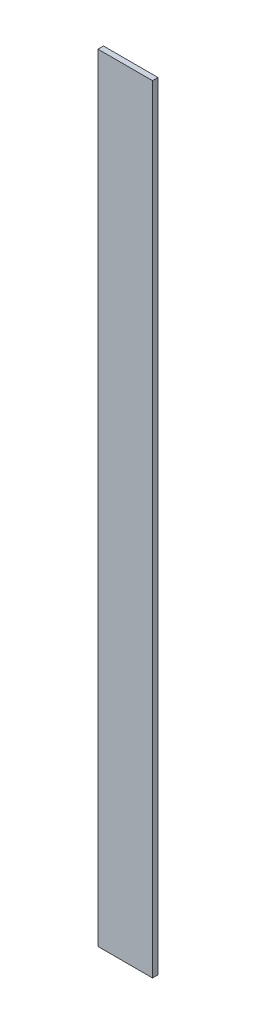
ISO-10303-21;
HEADER;
FILE_DESCRIPTION(('STEP AP214'),'2;1');
FILE_NAME('part.step','',(''),(''),'','','');
FILE_SCHEMA(('AUTOMOTIVE_DESIGN { 1 0 10303 214 1 1 1 1 }'));
ENDSEC;
DATA;
#1=APPLICATION_CONTEXT('core data for automotive mechanical design processes');
#2=APPLICATION_PROTOCOL_DEFINITION('international standard','automotive_design',2000,#1);
#3=PRODUCT_CONTEXT('',#1,'mechanical');
#4=PRODUCT('Part','Part','',(#3));
#5=PRODUCT_RELATED_PRODUCT_CATEGORY('part','',(#4));
#6=PRODUCT_DEFINITION_FORMATION('','',#4);
#7=PRODUCT_DEFINITION_CONTEXT('part definition',#1,'design');
#8=PRODUCT_DEFINITION('design','',#6,#7);
#9=PRODUCT_DEFINITION_SHAPE('','',#8);
#10=(LENGTH_UNIT() NAMED_UNIT(*) SI_UNIT(.MILLI.,.METRE.));
#11=(NAMED_UNIT(*) PLANE_ANGLE_UNIT() SI_UNIT($,.RADIAN.));
#12=(NAMED_UNIT(*) SI_UNIT($,.STERADIAN.) SOLID_ANGLE_UNIT());
#13=UNCERTAINTY_MEASURE_WITH_UNIT(LENGTH_MEASURE(1.E-05),#10,'distance_accuracy_value','');
#14=(GEOMETRIC_REPRESENTATION_CONTEXT(3) GLOBAL_UNCERTAINTY_ASSIGNED_CONTEXT((#13)) GLOBAL_UNIT_ASSIGNED_CONTEXT((#10,
#11,#12)) REPRESENTATION_CONTEXT('',''));
#15=CARTESIAN_POINT('',(0.,0.,0.));
#16=DIRECTION('',(0.,0.,1.));
#17=DIRECTION('',(1.,0.,0.));
#18=AXIS2_PLACEMENT_3D('',#15,#16,#17);
#19=CARTESIAN_POINT('',(0.,0.,3.175));
#20=DIRECTION('',(1.,0.,0.));
#21=DIRECTION('',(0.,0.,-1.));
#22=AXIS2_PLACEMENT_3D('',#19,#20,#21);
#23=PLANE('',#22);
#24=DIRECTION('',(0.,-1.,0.));
#25=VECTOR('',#24,1.);
#26=CARTESIAN_POINT('',(0.,0.,0.));
#27=LINE('',#26,#25);
#28=CARTESIAN_POINT('',(0.,450.,0.));
#29=VERTEX_POINT('',#28);
#30=CARTESIAN_POINT('',(0.,0.,0.));
#31=VERTEX_POINT('',#30);
#32=EDGE_CURVE('E111',#29,#31,#27,.T.);
#33=ORIENTED_EDGE('',*,*,#32,.T.);
#34=DIRECTION('',(0.,0.,-1.));
#35=VECTOR('',#34,1.);
#36=CARTESIAN_POINT('',(0.,0.,3.175));
#37=LINE('',#36,#35);
#38=CARTESIAN_POINT('',(0.,0.,3.175));
#39=VERTEX_POINT('',#38);
#40=EDGE_CURVE('E11',#39,#31,#37,.T.);
#41=ORIENTED_EDGE('',*,*,#40,.F.);
#42=DIRECTION('',(0.,-1.,0.));
#43=VECTOR('',#42,1.);
#44=CARTESIAN_POINT('',(0.,0.,3.175));
#45=LINE('',#44,#43);
#46=CARTESIAN_POINT('',(0.,450.,3.175));
#47=VERTEX_POINT('',#46);
#48=EDGE_CURVE('E95',#47,#39,#45,.T.);
#49=ORIENTED_EDGE('',*,*,#48,.F.);
#50=DIRECTION('',(0.,0.,-1.));
#51=VECTOR('',#50,1.);
#52=CARTESIAN_POINT('',(0.,450.,3.175));
#53=LINE('',#52,#51);
#54=EDGE_CURVE('E107',#47,#29,#53,.T.);
#55=ORIENTED_EDGE('',*,*,#54,.T.);
#56=EDGE_LOOP('',(#33,#41,#49,#55));
#57=FACE_BOUND('',#56,.T.);
#58=ADVANCED_FACE('F43',(#57),#23,.F.);
#59=CARTESIAN_POINT('',(0.,0.,3.175));
#60=DIRECTION('',(0.,1.,0.));
#61=DIRECTION('',(0.,0.,1.));
#62=AXIS2_PLACEMENT_3D('',#59,#60,#61);
#63=PLANE('',#62);
#64=DIRECTION('',(1.,0.,0.));
#65=VECTOR('',#64,1.);
#66=CARTESIAN_POINT('',(0.,0.,0.));
#67=LINE('',#66,#65);
#68=CARTESIAN_POINT('',(31.575,0.,0.));
#69=VERTEX_POINT('',#68);
#70=EDGE_CURVE('E100',#31,#69,#67,.T.);
#71=ORIENTED_EDGE('',*,*,#70,.T.);
#72=DIRECTION('',(0.,0.,-1.));
#73=VECTOR('',#72,1.);
#74=CARTESIAN_POINT('',(31.575,0.,3.175));
#75=LINE('',#74,#73);
#76=CARTESIAN_POINT('',(31.575,0.,3.175));
#77=VERTEX_POINT('',#76);
#78=EDGE_CURVE('E52',#77,#69,#75,.T.);
#79=ORIENTED_EDGE('',*,*,#78,.F.);
#80=DIRECTION('',(1.,0.,0.));
#81=VECTOR('',#80,1.);
#82=CARTESIAN_POINT('',(0.,0.,3.175));
#83=LINE('',#82,#81);
#84=EDGE_CURVE('E90',#39,#77,#83,.T.);
#85=ORIENTED_EDGE('',*,*,#84,.F.);
#86=ORIENTED_EDGE('',*,*,#40,.T.);
#87=EDGE_LOOP('',(#71,#79,#85,#86));
#88=FACE_BOUND('',#87,.T.);
#89=ADVANCED_FACE('F99',(#88),#63,.F.);
#90=CARTESIAN_POINT('',(31.575,0.,3.175));
#91=DIRECTION('',(-1.,0.,0.));
#92=DIRECTION('',(0.,0.,1.));
#93=AXIS2_PLACEMENT_3D('',#90,#91,#92);
#94=PLANE('',#93);
#95=DIRECTION('',(0.,1.,0.));
#96=VECTOR('',#95,1.);
#97=CARTESIAN_POINT('',(31.575,0.,0.));
#98=LINE('',#97,#96);
#99=CARTESIAN_POINT('',(31.575,450.,0.));
#100=VERTEX_POINT('',#99);
#101=EDGE_CURVE('E77',#69,#100,#98,.T.);
#102=ORIENTED_EDGE('',*,*,#101,.T.);
#103=DIRECTION('',(0.,0.,-1.));
#104=VECTOR('',#103,1.);
#105=CARTESIAN_POINT('',(31.575,450.,3.175));
#106=LINE('',#105,#104);
#107=CARTESIAN_POINT('',(31.575,450.,3.175));
#108=VERTEX_POINT('',#107);
#109=EDGE_CURVE('E102',#108,#100,#106,.T.);
#110=ORIENTED_EDGE('',*,*,#109,.F.);
#111=DIRECTION('',(0.,1.,0.));
#112=VECTOR('',#111,1.);
#113=CARTESIAN_POINT('',(31.575,0.,3.175));
#114=LINE('',#113,#112);
#115=EDGE_CURVE('E93',#77,#108,#114,.T.);
#116=ORIENTED_EDGE('',*,*,#115,.F.);
#117=ORIENTED_EDGE('',*,*,#78,.T.);
#118=EDGE_LOOP('',(#102,#110,#116,#117));
#119=FACE_BOUND('',#118,.T.);
#120=ADVANCED_FACE('F103',(#119),#94,.F.);
#121=CARTESIAN_POINT('',(0.,450.,3.175));
#122=DIRECTION('',(0.,-1.,0.));
#123=DIRECTION('',(0.,0.,-1.));
#124=AXIS2_PLACEMENT_3D('',#121,#122,#123);
#125=PLANE('',#124);
#126=DIRECTION('',(-1.,0.,0.));
#127=VECTOR('',#126,1.);
#128=CARTESIAN_POINT('',(0.,450.,0.));
#129=LINE('',#128,#127);
#130=EDGE_CURVE('E83',#100,#29,#129,.T.);
#131=ORIENTED_EDGE('',*,*,#130,.T.);
#132=ORIENTED_EDGE('',*,*,#54,.F.);
#133=DIRECTION('',(-1.,0.,0.));
#134=VECTOR('',#133,1.);
#135=CARTESIAN_POINT('',(0.,450.,3.175));
#136=LINE('',#135,#134);
#137=EDGE_CURVE('E60',#108,#47,#136,.T.);
#138=ORIENTED_EDGE('',*,*,#137,.F.);
#139=ORIENTED_EDGE('',*,*,#109,.T.);
#140=EDGE_LOOP('',(#131,#132,#138,#139));
#141=FACE_BOUND('',#140,.T.);
#142=ADVANCED_FACE('F124',(#141),#125,.F.);
#143=CARTESIAN_POINT('',(0.,0.,3.175));
#144=DIRECTION('',(0.,0.,-1.));
#145=DIRECTION('',(-1.,0.,0.));
#146=AXIS2_PLACEMENT_3D('',#143,#144,#145);
#147=PLANE('',#146);
#148=ORIENTED_EDGE('',*,*,#48,.T.);
#149=ORIENTED_EDGE('',*,*,#84,.T.);
#150=ORIENTED_EDGE('',*,*,#115,.T.);
#151=ORIENTED_EDGE('',*,*,#137,.T.);
#152=EDGE_LOOP('',(#148,#149,#150,#151));
#153=FACE_BOUND('',#152,.T.);
#154=ADVANCED_FACE('F91',(#153),#147,.F.);
#155=CARTESIAN_POINT('',(0.,0.,0.));
#156=DIRECTION('',(0.,0.,-1.));
#157=DIRECTION('',(-1.,0.,0.));
#158=AXIS2_PLACEMENT_3D('',#155,#156,#157);
#159=PLANE('',#158);
#160=ORIENTED_EDGE('',*,*,#32,.F.);
#161=ORIENTED_EDGE('',*,*,#130,.F.);
#162=ORIENTED_EDGE('',*,*,#101,.F.);
#163=ORIENTED_EDGE('',*,*,#70,.F.);
#164=EDGE_LOOP('',(#160,#161,#162,#163));
#165=FACE_BOUND('',#164,.T.);
#166=ADVANCED_FACE('F127',(#165),#159,.T.);
#167=CLOSED_SHELL('',(#58,#89,#120,#142,#154,#166));
#168=MANIFOLD_SOLID_BREP('B2',#167);
#169=ADVANCED_BREP_SHAPE_REPRESENTATION('',(#18,#168),#14);
#170=SHAPE_DEFINITION_REPRESENTATION(#9,#169);
ENDSEC;
END-ISO-10303-21;
